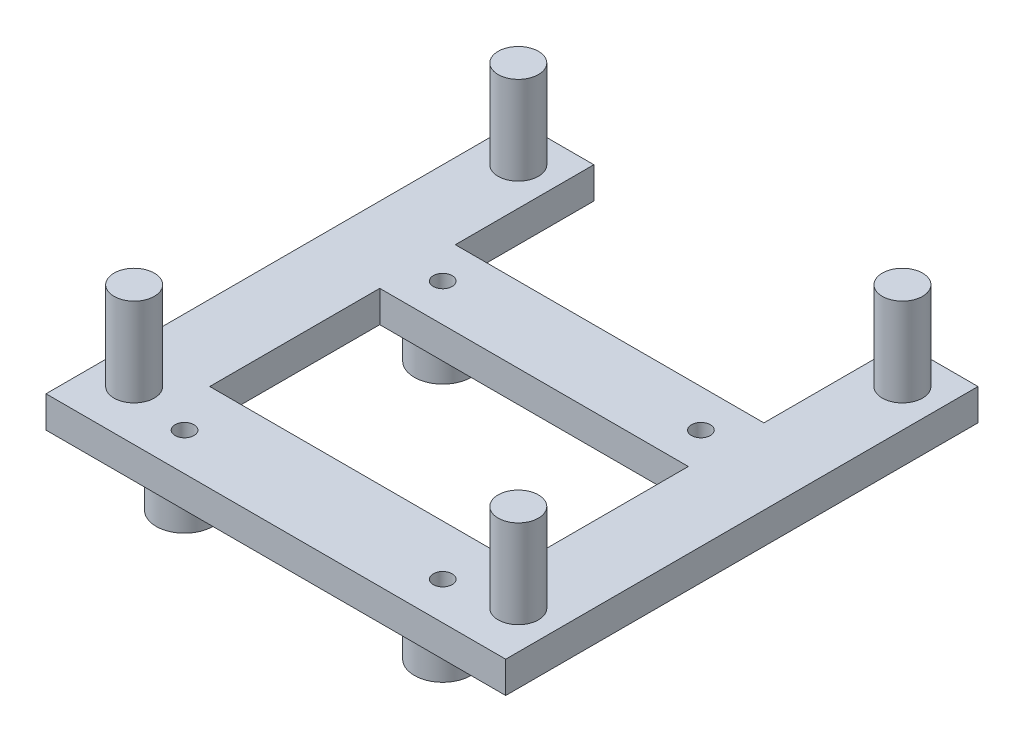
ISO-10303-21;
HEADER;
FILE_DESCRIPTION(('STEP AP214'),'2;1');
FILE_NAME('part.step','',(''),(''),'','','');
FILE_SCHEMA(('AUTOMOTIVE_DESIGN { 1 0 10303 214 1 1 1 1 }'));
ENDSEC;
DATA;
#1=APPLICATION_CONTEXT('core data for automotive mechanical design processes');
#2=APPLICATION_PROTOCOL_DEFINITION('international standard','automotive_design',2000,#1);
#3=PRODUCT_CONTEXT('',#1,'mechanical');
#4=PRODUCT('Part','Part','',(#3));
#5=PRODUCT_RELATED_PRODUCT_CATEGORY('part','',(#4));
#6=PRODUCT_DEFINITION_FORMATION('','',#4);
#7=PRODUCT_DEFINITION_CONTEXT('part definition',#1,'design');
#8=PRODUCT_DEFINITION('design','',#6,#7);
#9=PRODUCT_DEFINITION_SHAPE('','',#8);
#10=(LENGTH_UNIT() NAMED_UNIT(*) SI_UNIT(.MILLI.,.METRE.));
#11=(NAMED_UNIT(*) PLANE_ANGLE_UNIT() SI_UNIT($,.RADIAN.));
#12=(NAMED_UNIT(*) SI_UNIT($,.STERADIAN.) SOLID_ANGLE_UNIT());
#13=UNCERTAINTY_MEASURE_WITH_UNIT(LENGTH_MEASURE(1.E-05),#10,'distance_accuracy_value','');
#14=(GEOMETRIC_REPRESENTATION_CONTEXT(3) GLOBAL_UNCERTAINTY_ASSIGNED_CONTEXT((#13)) GLOBAL_UNIT_ASSIGNED_CONTEXT((#10,
#11,#12)) REPRESENTATION_CONTEXT('',''));
#15=CARTESIAN_POINT('',(0.,0.,0.));
#16=DIRECTION('',(0.,0.,1.));
#17=DIRECTION('',(1.,0.,0.));
#18=AXIS2_PLACEMENT_3D('',#15,#16,#17);
#19=CARTESIAN_POINT('',(-12.25,-2.5,12.25));
#20=DIRECTION('',(-1.,0.,0.));
#21=DIRECTION('',(0.,0.,1.));
#22=AXIS2_PLACEMENT_3D('',#19,#20,#21);
#23=PLANE('',#22);
#24=DIRECTION('',(0.,-1.,0.));
#25=VECTOR('',#24,1.);
#26=CARTESIAN_POINT('',(-12.25,25.2239965112589,-1.24999999999999));
#27=LINE('',#26,#25);
#28=CARTESIAN_POINT('',(-12.25,0.,-1.24999999999999));
#29=VERTEX_POINT('',#28);
#30=CARTESIAN_POINT('',(-12.25,-2.5,-1.24999999999999));
#31=VERTEX_POINT('',#30);
#32=EDGE_CURVE('E221',#29,#31,#27,.T.);
#33=ORIENTED_EDGE('',*,*,#32,.F.);
#34=DIRECTION('',(0.,0.,1.));
#35=VECTOR('',#34,1.);
#36=CARTESIAN_POINT('',(-12.25,0.,12.25));
#37=LINE('',#36,#35);
#38=CARTESIAN_POINT('',(-12.25,0.,12.25));
#39=VERTEX_POINT('',#38);
#40=EDGE_CURVE('E164',#29,#39,#37,.T.);
#41=ORIENTED_EDGE('',*,*,#40,.T.);
#42=DIRECTION('',(0.,1.,0.));
#43=VECTOR('',#42,1.);
#44=CARTESIAN_POINT('',(-12.25,-2.5,12.25));
#45=LINE('',#44,#43);
#46=CARTESIAN_POINT('',(-12.25,-2.5,12.25));
#47=VERTEX_POINT('',#46);
#48=EDGE_CURVE('E142',#47,#39,#45,.T.);
#49=ORIENTED_EDGE('',*,*,#48,.F.);
#50=DIRECTION('',(0.,0.,1.));
#51=VECTOR('',#50,1.);
#52=CARTESIAN_POINT('',(-12.25,-2.5,12.25));
#53=LINE('',#52,#51);
#54=EDGE_CURVE('E127',#31,#47,#53,.T.);
#55=ORIENTED_EDGE('',*,*,#54,.F.);
#56=EDGE_LOOP('',(#33,#41,#49,#55));
#57=FACE_BOUND('',#56,.T.);
#58=ADVANCED_FACE('F37',(#57),#23,.F.);
#59=CARTESIAN_POINT('',(12.25,-2.5,12.25));
#60=DIRECTION('',(1.,0.,0.));
#61=DIRECTION('',(0.,0.,-1.));
#62=AXIS2_PLACEMENT_3D('',#59,#60,#61);
#63=PLANE('',#62);
#64=DIRECTION('',(0.,-1.,0.));
#65=VECTOR('',#64,1.);
#66=CARTESIAN_POINT('',(12.25,25.2239965112589,-1.24999999999999));
#67=LINE('',#66,#65);
#68=CARTESIAN_POINT('',(12.25,0.,-1.24999999999999));
#69=VERTEX_POINT('',#68);
#70=CARTESIAN_POINT('',(12.25,-2.5,-1.24999999999999));
#71=VERTEX_POINT('',#70);
#72=EDGE_CURVE('E148',#69,#71,#67,.T.);
#73=ORIENTED_EDGE('',*,*,#72,.T.);
#74=DIRECTION('',(0.,0.,-1.));
#75=VECTOR('',#74,1.);
#76=CARTESIAN_POINT('',(12.25,-2.5,12.25));
#77=LINE('',#76,#75);
#78=CARTESIAN_POINT('',(12.25,-2.5,12.25));
#79=VERTEX_POINT('',#78);
#80=EDGE_CURVE('E125',#79,#71,#77,.T.);
#81=ORIENTED_EDGE('',*,*,#80,.F.);
#82=DIRECTION('',(0.,1.,0.));
#83=VECTOR('',#82,1.);
#84=CARTESIAN_POINT('',(12.25,-2.5,12.25));
#85=LINE('',#84,#83);
#86=CARTESIAN_POINT('',(12.25,0.,12.25));
#87=VERTEX_POINT('',#86);
#88=EDGE_CURVE('E135',#79,#87,#85,.T.);
#89=ORIENTED_EDGE('',*,*,#88,.T.);
#90=DIRECTION('',(0.,0.,-1.));
#91=VECTOR('',#90,1.);
#92=CARTESIAN_POINT('',(12.25,0.,12.25));
#93=LINE('',#92,#91);
#94=EDGE_CURVE('E169',#87,#69,#93,.T.);
#95=ORIENTED_EDGE('',*,*,#94,.T.);
#96=EDGE_LOOP('',(#73,#81,#89,#95));
#97=FACE_BOUND('',#96,.T.);
#98=ADVANCED_FACE('F146',(#97),#63,.F.);
#99=CARTESIAN_POINT('',(-15.25,7.,15.25));
#100=DIRECTION('',(0.,-1.,0.));
#101=DIRECTION('',(0.,0.,-1.));
#102=AXIS2_PLACEMENT_3D('',#99,#100,#101);
#103=CYLINDRICAL_SURFACE('',#102,1.6);
#104=CARTESIAN_POINT('',(-15.25,7.,15.25));
#105=DIRECTION('',(0.,1.,0.));
#106=DIRECTION('',(0.,0.,1.));
#107=AXIS2_PLACEMENT_3D('',#104,#105,#106);
#108=CIRCLE('',#107,1.6);
#109=CARTESIAN_POINT('',(-15.25,7.,16.85));
#110=VERTEX_POINT('',#109);
#111=EDGE_CURVE('E188',#110,#110,#108,.T.);
#112=ORIENTED_EDGE('',*,*,#111,.F.);
#113=EDGE_LOOP('',(#112));
#114=FACE_BOUND('',#113,.T.);
#115=CARTESIAN_POINT('',(-15.25,0.,15.25));
#116=DIRECTION('',(0.,1.,0.));
#117=DIRECTION('',(0.,0.,1.));
#118=AXIS2_PLACEMENT_3D('',#115,#116,#117);
#119=CIRCLE('',#118,1.6);
#120=CARTESIAN_POINT('',(-15.25,0.,16.85));
#121=VERTEX_POINT('',#120);
#122=EDGE_CURVE('E187',#121,#121,#119,.T.);
#123=ORIENTED_EDGE('',*,*,#122,.T.);
#124=EDGE_LOOP('',(#123));
#125=FACE_BOUND('',#124,.T.);
#126=ADVANCED_FACE('F39',(#114,#125),#103,.T.);
#127=CARTESIAN_POINT('',(-15.25,7.,15.25));
#128=DIRECTION('',(0.,1.,0.));
#129=DIRECTION('',(0.,0.,1.));
#130=AXIS2_PLACEMENT_3D('',#127,#128,#129);
#131=PLANE('',#130);
#132=ORIENTED_EDGE('',*,*,#111,.T.);
#133=EDGE_LOOP('',(#132));
#134=FACE_BOUND('',#133,.T.);
#135=ADVANCED_FACE('F360',(#134),#131,.T.);
#136=CARTESIAN_POINT('',(18.25,-2.5,19.25));
#137=DIRECTION('',(-1.,0.,0.));
#138=DIRECTION('',(0.,0.,1.));
#139=AXIS2_PLACEMENT_3D('',#136,#137,#138);
#140=PLANE('',#139);
#141=DIRECTION('',(0.,0.,1.));
#142=VECTOR('',#141,1.);
#143=CARTESIAN_POINT('',(18.25,0.,19.25));
#144=LINE('',#143,#142);
#145=CARTESIAN_POINT('',(18.25,0.,-18.25));
#146=VERTEX_POINT('',#145);
#147=CARTESIAN_POINT('',(18.25,0.,19.25));
#148=VERTEX_POINT('',#147);
#149=EDGE_CURVE('E154',#146,#148,#144,.T.);
#150=ORIENTED_EDGE('',*,*,#149,.T.);
#151=DIRECTION('',(0.,1.,0.));
#152=VECTOR('',#151,1.);
#153=CARTESIAN_POINT('',(18.25,-2.5,19.25));
#154=LINE('',#153,#152);
#155=CARTESIAN_POINT('',(18.25,-2.5,19.25));
#156=VERTEX_POINT('',#155);
#157=EDGE_CURVE('E185',#156,#148,#154,.T.);
#158=ORIENTED_EDGE('',*,*,#157,.F.);
#159=DIRECTION('',(0.,0.,1.));
#160=VECTOR('',#159,1.);
#161=CARTESIAN_POINT('',(18.25,-2.5,19.25));
#162=LINE('',#161,#160);
#163=CARTESIAN_POINT('',(18.25,-2.5,-18.25));
#164=VERTEX_POINT('',#163);
#165=EDGE_CURVE('E172',#164,#156,#162,.T.);
#166=ORIENTED_EDGE('',*,*,#165,.F.);
#167=DIRECTION('',(0.,1.,0.));
#168=VECTOR('',#167,1.);
#169=CARTESIAN_POINT('',(18.25,-2.5,-18.25));
#170=LINE('',#169,#168);
#171=EDGE_CURVE('E150',#164,#146,#170,.T.);
#172=ORIENTED_EDGE('',*,*,#171,.T.);
#173=EDGE_LOOP('',(#150,#158,#166,#172));
#174=FACE_BOUND('',#173,.T.);
#175=ADVANCED_FACE('F319',(#174),#140,.F.);
#176=CARTESIAN_POINT('',(18.25,-2.5,19.25));
#177=DIRECTION('',(0.,0.,-1.));
#178=DIRECTION('',(-1.,0.,0.));
#179=AXIS2_PLACEMENT_3D('',#176,#177,#178);
#180=PLANE('',#179);
#181=DIRECTION('',(-1.,0.,0.));
#182=VECTOR('',#181,1.);
#183=CARTESIAN_POINT('',(18.25,0.,19.25));
#184=LINE('',#183,#182);
#185=CARTESIAN_POINT('',(-18.25,0.,19.25));
#186=VERTEX_POINT('',#185);
#187=EDGE_CURVE('E157',#148,#186,#184,.T.);
#188=ORIENTED_EDGE('',*,*,#187,.T.);
#189=DIRECTION('',(0.,1.,0.));
#190=VECTOR('',#189,1.);
#191=CARTESIAN_POINT('',(-18.25,-2.5,19.25));
#192=LINE('',#191,#190);
#193=CARTESIAN_POINT('',(-18.25,-2.5,19.25));
#194=VERTEX_POINT('',#193);
#195=EDGE_CURVE('E182',#194,#186,#192,.T.);
#196=ORIENTED_EDGE('',*,*,#195,.F.);
#197=DIRECTION('',(-1.,0.,0.));
#198=VECTOR('',#197,1.);
#199=CARTESIAN_POINT('',(18.25,-2.5,19.25));
#200=LINE('',#199,#198);
#201=EDGE_CURVE('E101',#156,#194,#200,.T.);
#202=ORIENTED_EDGE('',*,*,#201,.F.);
#203=ORIENTED_EDGE('',*,*,#157,.T.);
#204=EDGE_LOOP('',(#188,#196,#202,#203));
#205=FACE_BOUND('',#204,.T.);
#206=ADVANCED_FACE('F353',(#205),#180,.F.);
#207=CARTESIAN_POINT('',(-18.25,-2.5,19.25));
#208=DIRECTION('',(1.,0.,0.));
#209=DIRECTION('',(0.,0.,-1.));
#210=AXIS2_PLACEMENT_3D('',#207,#208,#209);
#211=PLANE('',#210);
#212=DIRECTION('',(0.,0.,-1.));
#213=VECTOR('',#212,1.);
#214=CARTESIAN_POINT('',(-18.25,0.,19.25));
#215=LINE('',#214,#213);
#216=CARTESIAN_POINT('',(-18.25,0.,-18.25));
#217=VERTEX_POINT('',#216);
#218=EDGE_CURVE('E160',#186,#217,#215,.T.);
#219=ORIENTED_EDGE('',*,*,#218,.T.);
#220=DIRECTION('',(0.,1.,0.));
#221=VECTOR('',#220,1.);
#222=CARTESIAN_POINT('',(-18.25,-2.5,-18.25));
#223=LINE('',#222,#221);
#224=CARTESIAN_POINT('',(-18.25,-2.5,-18.25));
#225=VERTEX_POINT('',#224);
#226=EDGE_CURVE('E179',#225,#217,#223,.T.);
#227=ORIENTED_EDGE('',*,*,#226,.F.);
#228=DIRECTION('',(0.,0.,-1.));
#229=VECTOR('',#228,1.);
#230=CARTESIAN_POINT('',(-18.25,-2.5,19.25));
#231=LINE('',#230,#229);
#232=EDGE_CURVE('E281',#194,#225,#231,.T.);
#233=ORIENTED_EDGE('',*,*,#232,.F.);
#234=ORIENTED_EDGE('',*,*,#195,.T.);
#235=EDGE_LOOP('',(#219,#227,#233,#234));
#236=FACE_BOUND('',#235,.T.);
#237=ADVANCED_FACE('F348',(#236),#211,.F.);
#238=CARTESIAN_POINT('',(-18.25,-2.5,-18.25));
#239=DIRECTION('',(0.,0.,1.));
#240=DIRECTION('',(1.,0.,0.));
#241=AXIS2_PLACEMENT_3D('',#238,#239,#240);
#242=PLANE('',#241);
#243=DIRECTION('',(1.,0.,0.));
#244=VECTOR('',#243,1.);
#245=CARTESIAN_POINT('',(-18.25,0.,-18.25));
#246=LINE('',#245,#244);
#247=CARTESIAN_POINT('',(-12.25,0.,-18.25));
#248=VERTEX_POINT('',#247);
#249=EDGE_CURVE('E162',#217,#248,#246,.T.);
#250=ORIENTED_EDGE('',*,*,#249,.T.);
#251=DIRECTION('',(0.,1.,0.));
#252=VECTOR('',#251,1.);
#253=CARTESIAN_POINT('',(-12.25,-2.5,-18.25));
#254=LINE('',#253,#252);
#255=CARTESIAN_POINT('',(-12.25,-2.5,-18.25));
#256=VERTEX_POINT('',#255);
#257=EDGE_CURVE('E176',#256,#248,#254,.T.);
#258=ORIENTED_EDGE('',*,*,#257,.F.);
#259=DIRECTION('',(1.,0.,0.));
#260=VECTOR('',#259,1.);
#261=CARTESIAN_POINT('',(-18.25,-2.5,-18.25));
#262=LINE('',#261,#260);
#263=EDGE_CURVE('E283',#225,#256,#262,.T.);
#264=ORIENTED_EDGE('',*,*,#263,.F.);
#265=ORIENTED_EDGE('',*,*,#226,.T.);
#266=EDGE_LOOP('',(#250,#258,#264,#265));
#267=FACE_BOUND('',#266,.T.);
#268=ADVANCED_FACE('F343',(#267),#242,.F.);
#269=CARTESIAN_POINT('',(-12.25,0.,-7.24999999999999));
#270=VERTEX_POINT('',#269);
#271=EDGE_CURVE('E165',#248,#270,#37,.T.);
#272=ORIENTED_EDGE('',*,*,#271,.T.);
#273=DIRECTION('',(0.,-1.,0.));
#274=VECTOR('',#273,1.);
#275=CARTESIAN_POINT('',(-12.25,25.2239965112589,-7.24999999999999));
#276=LINE('',#275,#274);
#277=CARTESIAN_POINT('',(-12.25,-2.5,-7.24999999999999));
#278=VERTEX_POINT('',#277);
#279=EDGE_CURVE('E229',#270,#278,#276,.T.);
#280=ORIENTED_EDGE('',*,*,#279,.T.);
#281=EDGE_CURVE('E132',#256,#278,#53,.T.);
#282=ORIENTED_EDGE('',*,*,#281,.F.);
#283=ORIENTED_EDGE('',*,*,#257,.T.);
#284=EDGE_LOOP('',(#272,#280,#282,#283));
#285=FACE_BOUND('',#284,.T.);
#286=ADVANCED_FACE('F295',(#285),#23,.F.);
#287=CARTESIAN_POINT('',(-12.25,-2.5,12.25));
#288=DIRECTION('',(0.,0.,1.));
#289=DIRECTION('',(1.,0.,0.));
#290=AXIS2_PLACEMENT_3D('',#287,#288,#289);
#291=PLANE('',#290);
#292=DIRECTION('',(1.,0.,0.));
#293=VECTOR('',#292,1.);
#294=CARTESIAN_POINT('',(-12.25,0.,12.25));
#295=LINE('',#294,#293);
#296=EDGE_CURVE('E138',#39,#87,#295,.T.);
#297=ORIENTED_EDGE('',*,*,#296,.T.);
#298=ORIENTED_EDGE('',*,*,#88,.F.);
#299=DIRECTION('',(1.,0.,0.));
#300=VECTOR('',#299,1.);
#301=CARTESIAN_POINT('',(-12.25,-2.5,12.25));
#302=LINE('',#301,#300);
#303=EDGE_CURVE('E119',#47,#79,#302,.T.);
#304=ORIENTED_EDGE('',*,*,#303,.F.);
#305=ORIENTED_EDGE('',*,*,#48,.T.);
#306=EDGE_LOOP('',(#297,#298,#304,#305));
#307=FACE_BOUND('',#306,.T.);
#308=ADVANCED_FACE('F136',(#307),#291,.F.);
#309=CARTESIAN_POINT('',(12.25,-2.5,-7.24999999999999));
#310=VERTEX_POINT('',#309);
#311=CARTESIAN_POINT('',(12.25,-2.5,-18.25));
#312=VERTEX_POINT('',#311);
#313=EDGE_CURVE('E131',#310,#312,#77,.T.);
#314=ORIENTED_EDGE('',*,*,#313,.F.);
#315=DIRECTION('',(0.,-1.,0.));
#316=VECTOR('',#315,1.);
#317=CARTESIAN_POINT('',(12.25,25.2239965112589,-7.24999999999999));
#318=LINE('',#317,#316);
#319=CARTESIAN_POINT('',(12.25,0.,-7.24999999999999));
#320=VERTEX_POINT('',#319);
#321=EDGE_CURVE('E226',#320,#310,#318,.T.);
#322=ORIENTED_EDGE('',*,*,#321,.F.);
#323=CARTESIAN_POINT('',(12.25,0.,-18.25));
#324=VERTEX_POINT('',#323);
#325=EDGE_CURVE('E86',#320,#324,#93,.T.);
#326=ORIENTED_EDGE('',*,*,#325,.T.);
#327=DIRECTION('',(0.,1.,0.));
#328=VECTOR('',#327,1.);
#329=CARTESIAN_POINT('',(12.25,-2.5,-18.25));
#330=LINE('',#329,#328);
#331=EDGE_CURVE('E143',#312,#324,#330,.T.);
#332=ORIENTED_EDGE('',*,*,#331,.F.);
#333=EDGE_LOOP('',(#314,#322,#326,#332));
#334=FACE_BOUND('',#333,.T.);
#335=ADVANCED_FACE('F313',(#334),#63,.F.);
#336=CARTESIAN_POINT('',(18.25,-2.5,-18.25));
#337=DIRECTION('',(0.,0.,1.));
#338=DIRECTION('',(1.,0.,0.));
#339=AXIS2_PLACEMENT_3D('',#336,#337,#338);
#340=PLANE('',#339);
#341=DIRECTION('',(1.,0.,0.));
#342=VECTOR('',#341,1.);
#343=CARTESIAN_POINT('',(18.25,0.,-18.25));
#344=LINE('',#343,#342);
#345=EDGE_CURVE('E92',#324,#146,#344,.T.);
#346=ORIENTED_EDGE('',*,*,#345,.T.);
#347=ORIENTED_EDGE('',*,*,#171,.F.);
#348=DIRECTION('',(1.,0.,0.));
#349=VECTOR('',#348,1.);
#350=CARTESIAN_POINT('',(18.25,-2.5,-18.25));
#351=LINE('',#350,#349);
#352=EDGE_CURVE('E56',#312,#164,#351,.T.);
#353=ORIENTED_EDGE('',*,*,#352,.F.);
#354=ORIENTED_EDGE('',*,*,#331,.T.);
#355=EDGE_LOOP('',(#346,#347,#353,#354));
#356=FACE_BOUND('',#355,.T.);
#357=ADVANCED_FACE('F321',(#356),#340,.F.);
#358=CARTESIAN_POINT('',(0.,-2.5,0.));
#359=DIRECTION('',(0.,1.,0.));
#360=DIRECTION('',(0.,0.,1.));
#361=AXIS2_PLACEMENT_3D('',#358,#359,#360);
#362=PLANE('',#361);
#363=ORIENTED_EDGE('',*,*,#80,.T.);
#364=DIRECTION('',(1.,0.,0.));
#365=VECTOR('',#364,1.);
#366=CARTESIAN_POINT('',(-12.25,-2.5,-1.24999999999999));
#367=LINE('',#366,#365);
#368=EDGE_CURVE('E224',#31,#71,#367,.T.);
#369=ORIENTED_EDGE('',*,*,#368,.F.);
#370=ORIENTED_EDGE('',*,*,#54,.T.);
#371=ORIENTED_EDGE('',*,*,#303,.T.);
#372=EDGE_LOOP('',(#363,#369,#370,#371));
#373=FACE_BOUND('',#372,.T.);
#374=DIRECTION('',(1.,0.,0.));
#375=VECTOR('',#374,1.);
#376=CARTESIAN_POINT('',(-12.25,-2.5,-7.24999999999999));
#377=LINE('',#376,#375);
#378=EDGE_CURVE('E209',#278,#310,#377,.T.);
#379=ORIENTED_EDGE('',*,*,#378,.T.);
#380=ORIENTED_EDGE('',*,*,#313,.T.);
#381=ORIENTED_EDGE('',*,*,#352,.T.);
#382=ORIENTED_EDGE('',*,*,#165,.T.);
#383=ORIENTED_EDGE('',*,*,#201,.T.);
#384=ORIENTED_EDGE('',*,*,#232,.T.);
#385=ORIENTED_EDGE('',*,*,#263,.T.);
#386=ORIENTED_EDGE('',*,*,#281,.T.);
#387=EDGE_LOOP('',(#379,#380,#381,#382,#383,#384,#385,#386));
#388=FACE_BOUND('',#387,.T.);
#389=CARTESIAN_POINT('',(10.25,-2.5,-4.24999999999999));
#390=DIRECTION('',(0.,-1.,0.));
#391=DIRECTION('',(0.,0.,-1.));
#392=AXIS2_PLACEMENT_3D('',#389,#390,#391);
#393=CIRCLE('',#392,2.25000000000021);
#394=CARTESIAN_POINT('',(10.25,-2.5,-6.5000000000002));
#395=VERTEX_POINT('',#394);
#396=EDGE_CURVE('E244',#395,#395,#393,.T.);
#397=ORIENTED_EDGE('',*,*,#396,.F.);
#398=EDGE_LOOP('',(#397));
#399=FACE_BOUND('',#398,.T.);
#400=CARTESIAN_POINT('',(-10.25,-2.5,-4.24999999999999));
#401=DIRECTION('',(0.,-1.,0.));
#402=DIRECTION('',(0.,0.,-1.));
#403=AXIS2_PLACEMENT_3D('',#400,#401,#402);
#404=CIRCLE('',#403,2.25000000000021);
#405=CARTESIAN_POINT('',(-10.25,-2.5,-6.5000000000002));
#406=VERTEX_POINT('',#405);
#407=EDGE_CURVE('E235',#406,#406,#404,.T.);
#408=ORIENTED_EDGE('',*,*,#407,.F.);
#409=EDGE_LOOP('',(#408));
#410=FACE_BOUND('',#409,.T.);
#411=CARTESIAN_POINT('',(10.25,-2.5,16.25));
#412=DIRECTION('',(0.,1.,0.));
#413=DIRECTION('',(0.,0.,1.));
#414=AXIS2_PLACEMENT_3D('',#411,#412,#413);
#415=CIRCLE('',#414,2.25);
#416=CARTESIAN_POINT('',(10.25,-2.5,18.5));
#417=VERTEX_POINT('',#416);
#418=EDGE_CURVE('E11',#417,#417,#415,.F.);
#419=ORIENTED_EDGE('',*,*,#418,.F.);
#420=EDGE_LOOP('',(#419));
#421=FACE_BOUND('',#420,.T.);
#422=CARTESIAN_POINT('',(-10.25,-2.5,16.25));
#423=DIRECTION('',(0.,1.,0.));
#424=DIRECTION('',(0.,0.,1.));
#425=AXIS2_PLACEMENT_3D('',#422,#423,#424);
#426=CIRCLE('',#425,2.25);
#427=CARTESIAN_POINT('',(-10.25,-2.5,18.5));
#428=VERTEX_POINT('',#427);
#429=EDGE_CURVE('E47',#428,#428,#426,.F.);
#430=ORIENTED_EDGE('',*,*,#429,.F.);
#431=EDGE_LOOP('',(#430));
#432=FACE_BOUND('',#431,.T.);
#433=ADVANCED_FACE('F121',(#373,#388,#399,#410,#421,#432),#362,.F.);
#434=CARTESIAN_POINT('',(0.,0.,0.));
#435=DIRECTION('',(0.,1.,0.));
#436=DIRECTION('',(0.,0.,1.));
#437=AXIS2_PLACEMENT_3D('',#434,#435,#436);
#438=PLANE('',#437);
#439=CARTESIAN_POINT('',(-10.25,0.,-4.24999999999999));
#440=DIRECTION('',(0.,1.,0.));
#441=DIRECTION('',(0.,0.,1.));
#442=AXIS2_PLACEMENT_3D('',#439,#440,#441);
#443=CIRCLE('',#442,0.75);
#444=CARTESIAN_POINT('',(-10.25,0.,-3.49999999999999));
#445=VERTEX_POINT('',#444);
#446=EDGE_CURVE('E41',#445,#445,#443,.T.);
#447=ORIENTED_EDGE('',*,*,#446,.F.);
#448=EDGE_LOOP('',(#447));
#449=FACE_BOUND('',#448,.T.);
#450=CARTESIAN_POINT('',(10.25,0.,-4.24999999999999));
#451=DIRECTION('',(0.,1.,0.));
#452=DIRECTION('',(0.,0.,1.));
#453=AXIS2_PLACEMENT_3D('',#450,#451,#452);
#454=CIRCLE('',#453,0.75);
#455=CARTESIAN_POINT('',(10.25,0.,-3.49999999999999));
#456=VERTEX_POINT('',#455);
#457=EDGE_CURVE('E200',#456,#456,#454,.T.);
#458=ORIENTED_EDGE('',*,*,#457,.F.);
#459=EDGE_LOOP('',(#458));
#460=FACE_BOUND('',#459,.T.);
#461=CARTESIAN_POINT('',(10.25,0.,16.25));
#462=DIRECTION('',(0.,1.,0.));
#463=DIRECTION('',(0.,0.,1.));
#464=AXIS2_PLACEMENT_3D('',#461,#462,#463);
#465=CIRCLE('',#464,0.75);
#466=CARTESIAN_POINT('',(10.25,0.,17.));
#467=VERTEX_POINT('',#466);
#468=EDGE_CURVE('E198',#467,#467,#465,.T.);
#469=ORIENTED_EDGE('',*,*,#468,.F.);
#470=EDGE_LOOP('',(#469));
#471=FACE_BOUND('',#470,.T.);
#472=CARTESIAN_POINT('',(-10.25,0.,16.25));
#473=DIRECTION('',(0.,1.,0.));
#474=DIRECTION('',(0.,0.,1.));
#475=AXIS2_PLACEMENT_3D('',#472,#473,#474);
#476=CIRCLE('',#475,0.75);
#477=CARTESIAN_POINT('',(-10.25,0.,17.));
#478=VERTEX_POINT('',#477);
#479=EDGE_CURVE('E195',#478,#478,#476,.T.);
#480=ORIENTED_EDGE('',*,*,#479,.F.);
#481=EDGE_LOOP('',(#480));
#482=FACE_BOUND('',#481,.T.);
#483=DIRECTION('',(1.,0.,0.));
#484=VECTOR('',#483,1.);
#485=CARTESIAN_POINT('',(-12.25,0.,-1.24999999999999));
#486=LINE('',#485,#484);
#487=EDGE_CURVE('E205',#29,#69,#486,.T.);
#488=ORIENTED_EDGE('',*,*,#487,.T.);
#489=ORIENTED_EDGE('',*,*,#94,.F.);
#490=ORIENTED_EDGE('',*,*,#296,.F.);
#491=ORIENTED_EDGE('',*,*,#40,.F.);
#492=EDGE_LOOP('',(#488,#489,#490,#491));
#493=FACE_BOUND('',#492,.T.);
#494=CARTESIAN_POINT('',(15.25,0.,15.25));
#495=DIRECTION('',(0.,1.,0.));
#496=DIRECTION('',(0.,0.,1.));
#497=AXIS2_PLACEMENT_3D('',#494,#495,#496);
#498=CIRCLE('',#497,1.6);
#499=CARTESIAN_POINT('',(15.25,0.,16.85));
#500=VERTEX_POINT('',#499);
#501=EDGE_CURVE('E262',#500,#500,#498,.T.);
#502=ORIENTED_EDGE('',*,*,#501,.F.);
#503=EDGE_LOOP('',(#502));
#504=FACE_BOUND('',#503,.T.);
#505=CARTESIAN_POINT('',(15.25,0.,-15.25));
#506=DIRECTION('',(0.,1.,0.));
#507=DIRECTION('',(0.,0.,1.));
#508=AXIS2_PLACEMENT_3D('',#505,#506,#507);
#509=CIRCLE('',#508,1.6);
#510=CARTESIAN_POINT('',(15.25,0.,-13.65));
#511=VERTEX_POINT('',#510);
#512=EDGE_CURVE('E266',#511,#511,#509,.T.);
#513=ORIENTED_EDGE('',*,*,#512,.F.);
#514=EDGE_LOOP('',(#513));
#515=FACE_BOUND('',#514,.T.);
#516=CARTESIAN_POINT('',(-15.25,0.,-15.25));
#517=DIRECTION('',(0.,1.,0.));
#518=DIRECTION('',(0.,0.,1.));
#519=AXIS2_PLACEMENT_3D('',#516,#517,#518);
#520=CIRCLE('',#519,1.6);
#521=CARTESIAN_POINT('',(-15.25,0.,-13.65));
#522=VERTEX_POINT('',#521);
#523=EDGE_CURVE('E272',#522,#522,#520,.T.);
#524=ORIENTED_EDGE('',*,*,#523,.F.);
#525=EDGE_LOOP('',(#524));
#526=FACE_BOUND('',#525,.T.);
#527=ORIENTED_EDGE('',*,*,#122,.F.);
#528=EDGE_LOOP('',(#527));
#529=FACE_BOUND('',#528,.T.);
#530=ORIENTED_EDGE('',*,*,#149,.F.);
#531=ORIENTED_EDGE('',*,*,#345,.F.);
#532=ORIENTED_EDGE('',*,*,#325,.F.);
#533=DIRECTION('',(1.,0.,0.));
#534=VECTOR('',#533,1.);
#535=CARTESIAN_POINT('',(-12.25,0.,-7.24999999999999));
#536=LINE('',#535,#534);
#537=EDGE_CURVE('E216',#270,#320,#536,.T.);
#538=ORIENTED_EDGE('',*,*,#537,.F.);
#539=ORIENTED_EDGE('',*,*,#271,.F.);
#540=ORIENTED_EDGE('',*,*,#249,.F.);
#541=ORIENTED_EDGE('',*,*,#218,.F.);
#542=ORIENTED_EDGE('',*,*,#187,.F.);
#543=EDGE_LOOP('',(#530,#531,#532,#538,#539,#540,#541,#542));
#544=FACE_BOUND('',#543,.T.);
#545=ADVANCED_FACE('F315',(#449,#460,#471,#482,#493,#504,#515,#526,#529,#544),#438,.T.);
#546=CARTESIAN_POINT('',(-15.25,7.,-15.25));
#547=DIRECTION('',(0.,-1.,0.));
#548=DIRECTION('',(0.,0.,-1.));
#549=AXIS2_PLACEMENT_3D('',#546,#547,#548);
#550=CYLINDRICAL_SURFACE('',#549,1.6);
#551=CARTESIAN_POINT('',(-15.25,7.,-15.25));
#552=DIRECTION('',(0.,1.,0.));
#553=DIRECTION('',(0.,0.,1.));
#554=AXIS2_PLACEMENT_3D('',#551,#552,#553);
#555=CIRCLE('',#554,1.6);
#556=CARTESIAN_POINT('',(-15.25,7.,-13.65));
#557=VERTEX_POINT('',#556);
#558=EDGE_CURVE('E158',#557,#557,#555,.T.);
#559=ORIENTED_EDGE('',*,*,#558,.F.);
#560=EDGE_LOOP('',(#559));
#561=FACE_BOUND('',#560,.T.);
#562=ORIENTED_EDGE('',*,*,#523,.T.);
#563=EDGE_LOOP('',(#562));
#564=FACE_BOUND('',#563,.T.);
#565=ADVANCED_FACE('F372',(#561,#564),#550,.T.);
#566=CARTESIAN_POINT('',(-15.25,7.,-15.25));
#567=DIRECTION('',(0.,1.,0.));
#568=DIRECTION('',(0.,0.,1.));
#569=AXIS2_PLACEMENT_3D('',#566,#567,#568);
#570=PLANE('',#569);
#571=ORIENTED_EDGE('',*,*,#558,.T.);
#572=EDGE_LOOP('',(#571));
#573=FACE_BOUND('',#572,.T.);
#574=ADVANCED_FACE('F377',(#573),#570,.T.);
#575=CARTESIAN_POINT('',(15.25,7.,-15.25));
#576=DIRECTION('',(0.,-1.,0.));
#577=DIRECTION('',(0.,0.,-1.));
#578=AXIS2_PLACEMENT_3D('',#575,#576,#577);
#579=CYLINDRICAL_SURFACE('',#578,1.6);
#580=CARTESIAN_POINT('',(15.25,7.,-15.25));
#581=DIRECTION('',(0.,1.,0.));
#582=DIRECTION('',(0.,0.,1.));
#583=AXIS2_PLACEMENT_3D('',#580,#581,#582);
#584=CIRCLE('',#583,1.6);
#585=CARTESIAN_POINT('',(15.25,7.,-13.65));
#586=VERTEX_POINT('',#585);
#587=EDGE_CURVE('E269',#586,#586,#584,.T.);
#588=ORIENTED_EDGE('',*,*,#587,.F.);
#589=EDGE_LOOP('',(#588));
#590=FACE_BOUND('',#589,.T.);
#591=ORIENTED_EDGE('',*,*,#512,.T.);
#592=EDGE_LOOP('',(#591));
#593=FACE_BOUND('',#592,.T.);
#594=ADVANCED_FACE('F384',(#590,#593),#579,.T.);
#595=CARTESIAN_POINT('',(15.25,7.,-15.25));
#596=DIRECTION('',(0.,1.,0.));
#597=DIRECTION('',(0.,0.,1.));
#598=AXIS2_PLACEMENT_3D('',#595,#596,#597);
#599=PLANE('',#598);
#600=ORIENTED_EDGE('',*,*,#587,.T.);
#601=EDGE_LOOP('',(#600));
#602=FACE_BOUND('',#601,.T.);
#603=ADVANCED_FACE('F388',(#602),#599,.T.);
#604=CARTESIAN_POINT('',(15.25,7.,15.25));
#605=DIRECTION('',(0.,-1.,0.));
#606=DIRECTION('',(0.,0.,-1.));
#607=AXIS2_PLACEMENT_3D('',#604,#605,#606);
#608=CYLINDRICAL_SURFACE('',#607,1.6);
#609=CARTESIAN_POINT('',(15.25,7.,15.25));
#610=DIRECTION('',(0.,1.,0.));
#611=DIRECTION('',(0.,0.,1.));
#612=AXIS2_PLACEMENT_3D('',#609,#610,#611);
#613=CIRCLE('',#612,1.6);
#614=CARTESIAN_POINT('',(15.25,7.,16.85));
#615=VERTEX_POINT('',#614);
#616=EDGE_CURVE('E263',#615,#615,#613,.T.);
#617=ORIENTED_EDGE('',*,*,#616,.F.);
#618=EDGE_LOOP('',(#617));
#619=FACE_BOUND('',#618,.T.);
#620=ORIENTED_EDGE('',*,*,#501,.T.);
#621=EDGE_LOOP('',(#620));
#622=FACE_BOUND('',#621,.T.);
#623=ADVANCED_FACE('F392',(#619,#622),#608,.T.);
#624=CARTESIAN_POINT('',(15.25,7.,15.25));
#625=DIRECTION('',(0.,1.,0.));
#626=DIRECTION('',(0.,0.,1.));
#627=AXIS2_PLACEMENT_3D('',#624,#625,#626);
#628=PLANE('',#627);
#629=ORIENTED_EDGE('',*,*,#616,.T.);
#630=EDGE_LOOP('',(#629));
#631=FACE_BOUND('',#630,.T.);
#632=ADVANCED_FACE('F396',(#631),#628,.T.);
#633=CARTESIAN_POINT('',(-10.25,-5.5,16.25));
#634=DIRECTION('',(0.,-1.,0.));
#635=DIRECTION('',(0.,0.,-1.));
#636=AXIS2_PLACEMENT_3D('',#633,#634,#635);
#637=PLANE('',#636);
#638=CARTESIAN_POINT('',(-10.25,-5.5,16.25));
#639=DIRECTION('',(0.,-1.,0.));
#640=DIRECTION('',(0.,0.,-1.));
#641=AXIS2_PLACEMENT_3D('',#638,#639,#640);
#642=CIRCLE('',#641,2.25);
#643=CARTESIAN_POINT('',(-10.25,-5.5,14.));
#644=VERTEX_POINT('',#643);
#645=EDGE_CURVE('E259',#644,#644,#642,.T.);
#646=ORIENTED_EDGE('',*,*,#645,.T.);
#647=EDGE_LOOP('',(#646));
#648=FACE_BOUND('',#647,.T.);
#649=CARTESIAN_POINT('',(-10.25,-5.5,16.25));
#650=DIRECTION('',(0.,-1.,0.));
#651=DIRECTION('',(0.,0.,-1.));
#652=AXIS2_PLACEMENT_3D('',#649,#650,#651);
#653=CIRCLE('',#652,0.75);
#654=CARTESIAN_POINT('',(-10.25,-5.5,15.5));
#655=VERTEX_POINT('',#654);
#656=EDGE_CURVE('E256',#655,#655,#653,.T.);
#657=ORIENTED_EDGE('',*,*,#656,.F.);
#658=EDGE_LOOP('',(#657));
#659=FACE_BOUND('',#658,.T.);
#660=ADVANCED_FACE('F400',(#648,#659),#637,.T.);
#661=CARTESIAN_POINT('',(-10.25,-5.5,16.25));
#662=DIRECTION('',(0.,1.,0.));
#663=DIRECTION('',(0.,0.,1.));
#664=AXIS2_PLACEMENT_3D('',#661,#662,#663);
#665=CYLINDRICAL_SURFACE('',#664,2.25);
#666=ORIENTED_EDGE('',*,*,#645,.F.);
#667=EDGE_LOOP('',(#666));
#668=FACE_BOUND('',#667,.T.);
#669=ORIENTED_EDGE('',*,*,#429,.T.);
#670=EDGE_LOOP('',(#669));
#671=FACE_BOUND('',#670,.T.);
#672=ADVANCED_FACE('F402',(#668,#671),#665,.T.);
#673=CARTESIAN_POINT('',(-10.25,-5.5,16.25));
#674=DIRECTION('',(0.,1.,0.));
#675=DIRECTION('',(0.,0.,1.));
#676=AXIS2_PLACEMENT_3D('',#673,#674,#675);
#677=CYLINDRICAL_SURFACE('',#676,0.75);
#678=ORIENTED_EDGE('',*,*,#656,.T.);
#679=EDGE_LOOP('',(#678));
#680=FACE_BOUND('',#679,.T.);
#681=ORIENTED_EDGE('',*,*,#479,.T.);
#682=EDGE_LOOP('',(#681));
#683=FACE_BOUND('',#682,.T.);
#684=ADVANCED_FACE('F405',(#680,#683),#677,.F.);
#685=CARTESIAN_POINT('',(10.25,-5.5,16.25));
#686=DIRECTION('',(0.,-1.,0.));
#687=DIRECTION('',(0.,0.,-1.));
#688=AXIS2_PLACEMENT_3D('',#685,#686,#687);
#689=PLANE('',#688);
#690=CARTESIAN_POINT('',(10.25,-5.5,16.25));
#691=DIRECTION('',(0.,-1.,0.));
#692=DIRECTION('',(0.,0.,-1.));
#693=AXIS2_PLACEMENT_3D('',#690,#691,#692);
#694=CIRCLE('',#693,2.25);
#695=CARTESIAN_POINT('',(10.25,-5.5,14.));
#696=VERTEX_POINT('',#695);
#697=EDGE_CURVE('E253',#696,#696,#694,.T.);
#698=ORIENTED_EDGE('',*,*,#697,.T.);
#699=EDGE_LOOP('',(#698));
#700=FACE_BOUND('',#699,.T.);
#701=CARTESIAN_POINT('',(10.25,-5.5,16.25));
#702=DIRECTION('',(0.,-1.,0.));
#703=DIRECTION('',(0.,0.,-1.));
#704=AXIS2_PLACEMENT_3D('',#701,#702,#703);
#705=CIRCLE('',#704,0.75);
#706=CARTESIAN_POINT('',(10.25,-5.5,15.5));
#707=VERTEX_POINT('',#706);
#708=EDGE_CURVE('E248',#707,#707,#705,.T.);
#709=ORIENTED_EDGE('',*,*,#708,.F.);
#710=EDGE_LOOP('',(#709));
#711=FACE_BOUND('',#710,.T.);
#712=ADVANCED_FACE('F411',(#700,#711),#689,.T.);
#713=CARTESIAN_POINT('',(10.25,-5.5,16.25));
#714=DIRECTION('',(0.,1.,0.));
#715=DIRECTION('',(0.,0.,1.));
#716=AXIS2_PLACEMENT_3D('',#713,#714,#715);
#717=CYLINDRICAL_SURFACE('',#716,2.25);
#718=ORIENTED_EDGE('',*,*,#697,.F.);
#719=EDGE_LOOP('',(#718));
#720=FACE_BOUND('',#719,.T.);
#721=ORIENTED_EDGE('',*,*,#418,.T.);
#722=EDGE_LOOP('',(#721));
#723=FACE_BOUND('',#722,.T.);
#724=ADVANCED_FACE('F413',(#720,#723),#717,.T.);
#725=CARTESIAN_POINT('',(10.25,-5.5,16.25));
#726=DIRECTION('',(0.,1.,0.));
#727=DIRECTION('',(0.,0.,1.));
#728=AXIS2_PLACEMENT_3D('',#725,#726,#727);
#729=CYLINDRICAL_SURFACE('',#728,0.75);
#730=ORIENTED_EDGE('',*,*,#708,.T.);
#731=EDGE_LOOP('',(#730));
#732=FACE_BOUND('',#731,.T.);
#733=ORIENTED_EDGE('',*,*,#468,.T.);
#734=EDGE_LOOP('',(#733));
#735=FACE_BOUND('',#734,.T.);
#736=ADVANCED_FACE('F416',(#732,#735),#729,.F.);
#737=CARTESIAN_POINT('',(10.25,-5.5,-4.24999999999999));
#738=DIRECTION('',(0.,-1.,0.));
#739=DIRECTION('',(0.,0.,-1.));
#740=AXIS2_PLACEMENT_3D('',#737,#738,#739);
#741=PLANE('',#740);
#742=CARTESIAN_POINT('',(10.25,-5.5,-4.24999999999999));
#743=DIRECTION('',(0.,-1.,0.));
#744=DIRECTION('',(0.,0.,-1.));
#745=AXIS2_PLACEMENT_3D('',#742,#743,#744);
#746=CIRCLE('',#745,2.25000000000021);
#747=CARTESIAN_POINT('',(10.25,-5.5,-6.5000000000002));
#748=VERTEX_POINT('',#747);
#749=EDGE_CURVE('E245',#748,#748,#746,.T.);
#750=ORIENTED_EDGE('',*,*,#749,.T.);
#751=EDGE_LOOP('',(#750));
#752=FACE_BOUND('',#751,.T.);
#753=CARTESIAN_POINT('',(10.25,-5.5,-4.24999999999999));
#754=DIRECTION('',(0.,-1.,0.));
#755=DIRECTION('',(0.,0.,-1.));
#756=AXIS2_PLACEMENT_3D('',#753,#754,#755);
#757=CIRCLE('',#756,0.75);
#758=CARTESIAN_POINT('',(10.25,-5.5,-4.99999999999999));
#759=VERTEX_POINT('',#758);
#760=EDGE_CURVE('E239',#759,#759,#757,.T.);
#761=ORIENTED_EDGE('',*,*,#760,.F.);
#762=EDGE_LOOP('',(#761));
#763=FACE_BOUND('',#762,.T.);
#764=ADVANCED_FACE('F423',(#752,#763),#741,.T.);
#765=CARTESIAN_POINT('',(10.25,-5.5,-4.24999999999999));
#766=DIRECTION('',(0.,1.,0.));
#767=DIRECTION('',(0.,0.,1.));
#768=AXIS2_PLACEMENT_3D('',#765,#766,#767);
#769=CYLINDRICAL_SURFACE('',#768,2.25000000000021);
#770=ORIENTED_EDGE('',*,*,#749,.F.);
#771=EDGE_LOOP('',(#770));
#772=FACE_BOUND('',#771,.T.);
#773=ORIENTED_EDGE('',*,*,#396,.T.);
#774=EDGE_LOOP('',(#773));
#775=FACE_BOUND('',#774,.T.);
#776=ADVANCED_FACE('F425',(#772,#775),#769,.T.);
#777=CARTESIAN_POINT('',(10.25,-5.5,-4.24999999999999));
#778=DIRECTION('',(0.,1.,0.));
#779=DIRECTION('',(0.,0.,1.));
#780=AXIS2_PLACEMENT_3D('',#777,#778,#779);
#781=CYLINDRICAL_SURFACE('',#780,0.75);
#782=ORIENTED_EDGE('',*,*,#760,.T.);
#783=EDGE_LOOP('',(#782));
#784=FACE_BOUND('',#783,.T.);
#785=ORIENTED_EDGE('',*,*,#457,.T.);
#786=EDGE_LOOP('',(#785));
#787=FACE_BOUND('',#786,.T.);
#788=ADVANCED_FACE('F428',(#784,#787),#781,.F.);
#789=CARTESIAN_POINT('',(-10.25,-5.5,-4.24999999999999));
#790=DIRECTION('',(0.,-1.,0.));
#791=DIRECTION('',(0.,0.,-1.));
#792=AXIS2_PLACEMENT_3D('',#789,#790,#791);
#793=PLANE('',#792);
#794=CARTESIAN_POINT('',(-10.25,-5.5,-4.24999999999999));
#795=DIRECTION('',(0.,-1.,0.));
#796=DIRECTION('',(0.,0.,-1.));
#797=AXIS2_PLACEMENT_3D('',#794,#795,#796);
#798=CIRCLE('',#797,2.25000000000021);
#799=CARTESIAN_POINT('',(-10.25,-5.5,-6.5000000000002));
#800=VERTEX_POINT('',#799);
#801=EDGE_CURVE('E236',#800,#800,#798,.T.);
#802=ORIENTED_EDGE('',*,*,#801,.T.);
#803=EDGE_LOOP('',(#802));
#804=FACE_BOUND('',#803,.T.);
#805=CARTESIAN_POINT('',(-10.25,-5.5,-4.24999999999999));
#806=DIRECTION('',(0.,-1.,0.));
#807=DIRECTION('',(0.,0.,-1.));
#808=AXIS2_PLACEMENT_3D('',#805,#806,#807);
#809=CIRCLE('',#808,0.75);
#810=CARTESIAN_POINT('',(-10.25,-5.5,-4.99999999999999));
#811=VERTEX_POINT('',#810);
#812=EDGE_CURVE('E232',#811,#811,#809,.T.);
#813=ORIENTED_EDGE('',*,*,#812,.F.);
#814=EDGE_LOOP('',(#813));
#815=FACE_BOUND('',#814,.T.);
#816=ADVANCED_FACE('F435',(#804,#815),#793,.T.);
#817=CARTESIAN_POINT('',(-10.25,-5.5,-4.24999999999999));
#818=DIRECTION('',(0.,1.,0.));
#819=DIRECTION('',(0.,0.,1.));
#820=AXIS2_PLACEMENT_3D('',#817,#818,#819);
#821=CYLINDRICAL_SURFACE('',#820,2.25000000000021);
#822=ORIENTED_EDGE('',*,*,#801,.F.);
#823=EDGE_LOOP('',(#822));
#824=FACE_BOUND('',#823,.T.);
#825=ORIENTED_EDGE('',*,*,#407,.T.);
#826=EDGE_LOOP('',(#825));
#827=FACE_BOUND('',#826,.T.);
#828=ADVANCED_FACE('F437',(#824,#827),#821,.T.);
#829=CARTESIAN_POINT('',(-10.25,-5.5,-4.24999999999999));
#830=DIRECTION('',(0.,1.,0.));
#831=DIRECTION('',(0.,0.,1.));
#832=AXIS2_PLACEMENT_3D('',#829,#830,#831);
#833=CYLINDRICAL_SURFACE('',#832,0.75);
#834=ORIENTED_EDGE('',*,*,#812,.T.);
#835=EDGE_LOOP('',(#834));
#836=FACE_BOUND('',#835,.T.);
#837=ORIENTED_EDGE('',*,*,#446,.T.);
#838=EDGE_LOOP('',(#837));
#839=FACE_BOUND('',#838,.T.);
#840=ADVANCED_FACE('F440',(#836,#839),#833,.F.);
#841=CARTESIAN_POINT('',(-12.25,25.2239965112589,-1.24999999999999));
#842=DIRECTION('',(0.,0.,-1.));
#843=DIRECTION('',(-1.,0.,0.));
#844=AXIS2_PLACEMENT_3D('',#841,#842,#843);
#845=PLANE('',#844);
#846=ORIENTED_EDGE('',*,*,#487,.F.);
#847=ORIENTED_EDGE('',*,*,#32,.T.);
#848=ORIENTED_EDGE('',*,*,#368,.T.);
#849=ORIENTED_EDGE('',*,*,#72,.F.);
#850=EDGE_LOOP('',(#846,#847,#848,#849));
#851=FACE_BOUND('',#850,.T.);
#852=ADVANCED_FACE('F447',(#851),#845,.F.);
#853=CARTESIAN_POINT('',(-12.25,25.2239965112589,-7.24999999999999));
#854=DIRECTION('',(0.,0.,-1.));
#855=DIRECTION('',(-1.,0.,0.));
#856=AXIS2_PLACEMENT_3D('',#853,#854,#855);
#857=PLANE('',#856);
#858=ORIENTED_EDGE('',*,*,#279,.F.);
#859=ORIENTED_EDGE('',*,*,#537,.T.);
#860=ORIENTED_EDGE('',*,*,#321,.T.);
#861=ORIENTED_EDGE('',*,*,#378,.F.);
#862=EDGE_LOOP('',(#858,#859,#860,#861));
#863=FACE_BOUND('',#862,.T.);
#864=ADVANCED_FACE('F300',(#863),#857,.T.);
#865=CLOSED_SHELL('',(#58,#98,#126,#135,#175,#206,#237,#268,#286,#308,#335,#357,#433,#545,#565,
#574,#594,#603,#623,#632,#660,#672,#684,#712,#724,#736,#764,#776,#788,#816,#828,#840,#852,#864));
#866=MANIFOLD_SOLID_BREP('B2',#865);
#867=ADVANCED_BREP_SHAPE_REPRESENTATION('',(#18,#866),#14);
#868=SHAPE_DEFINITION_REPRESENTATION(#9,#867);
ENDSEC;
END-ISO-10303-21;
